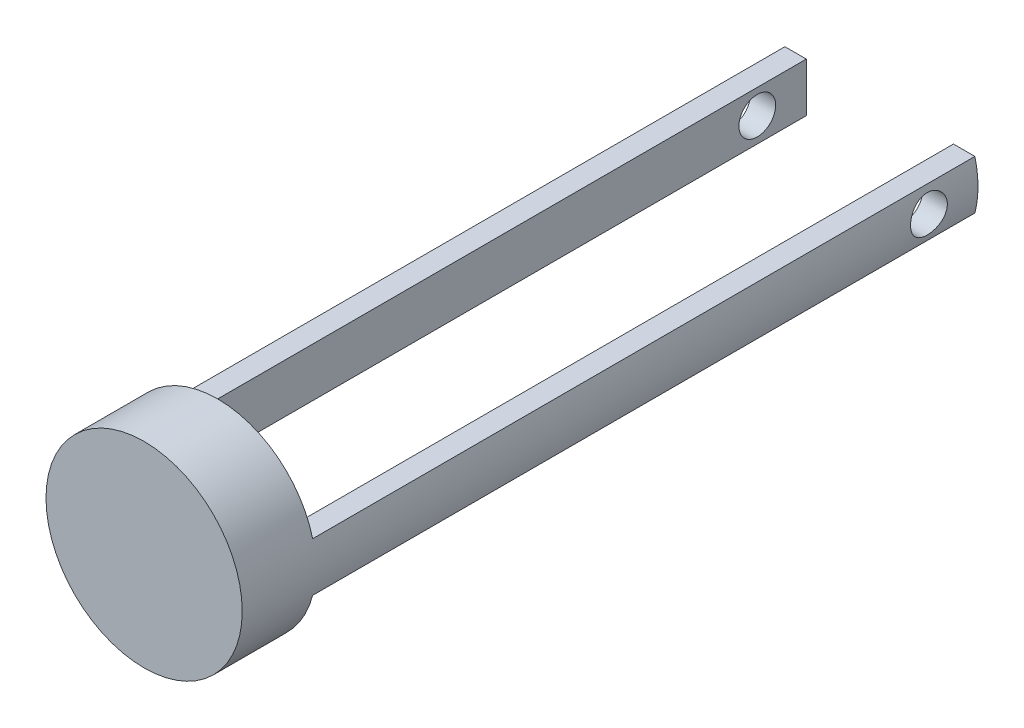
ISO-10303-21;
HEADER;
FILE_DESCRIPTION(('STEP AP214'),'2;1');
FILE_NAME('part.step','',(''),(''),'','','');
FILE_SCHEMA(('AUTOMOTIVE_DESIGN { 1 0 10303 214 1 1 1 1 }'));
ENDSEC;
DATA;
#1=APPLICATION_CONTEXT('core data for automotive mechanical design processes');
#2=APPLICATION_PROTOCOL_DEFINITION('international standard','automotive_design',2000,#1);
#3=PRODUCT_CONTEXT('',#1,'mechanical');
#4=PRODUCT('Part','Part','',(#3));
#5=PRODUCT_RELATED_PRODUCT_CATEGORY('part','',(#4));
#6=PRODUCT_DEFINITION_FORMATION('','',#4);
#7=PRODUCT_DEFINITION_CONTEXT('part definition',#1,'design');
#8=PRODUCT_DEFINITION('design','',#6,#7);
#9=PRODUCT_DEFINITION_SHAPE('','',#8);
#10=(LENGTH_UNIT() NAMED_UNIT(*) SI_UNIT(.MILLI.,.METRE.));
#11=(NAMED_UNIT(*) PLANE_ANGLE_UNIT() SI_UNIT($,.RADIAN.));
#12=(NAMED_UNIT(*) SI_UNIT($,.STERADIAN.) SOLID_ANGLE_UNIT());
#13=UNCERTAINTY_MEASURE_WITH_UNIT(LENGTH_MEASURE(1.E-05),#10,'distance_accuracy_value','');
#14=(GEOMETRIC_REPRESENTATION_CONTEXT(3) GLOBAL_UNCERTAINTY_ASSIGNED_CONTEXT((#13)) GLOBAL_UNIT_ASSIGNED_CONTEXT((#10,
#11,#12)) REPRESENTATION_CONTEXT('',''));
#15=CARTESIAN_POINT('',(0.,0.,0.));
#16=DIRECTION('',(0.,0.,1.));
#17=DIRECTION('',(1.,0.,0.));
#18=AXIS2_PLACEMENT_3D('',#15,#16,#17);
#19=CARTESIAN_POINT('',(0.,0.,-38.1));
#20=DIRECTION('',(0.,0.,1.));
#21=DIRECTION('',(1.,0.,0.));
#22=AXIS2_PLACEMENT_3D('',#19,#20,#21);
#23=CYLINDRICAL_SURFACE('',#22,50.8);
#24=CARTESIAN_POINT('',(-50.8,0.,-365.125));
#25=CARTESIAN_POINT('',(-50.8000023043984,-0.265112508847247,-365.125004788771));
#26=CARTESIAN_POINT('',(-50.797920970951,-0.530163183869243,-365.113928461929));
#27=CARTESIAN_POINT('',(-50.7896587686576,-1.05843450705729,-365.069718641948));
#28=CARTESIAN_POINT('',(-50.7834771603281,-1.32165481646296,-365.036581170084));
#29=CARTESIAN_POINT('',(-50.7671781209653,-1.84448038090155,-364.948468416572));
#30=CARTESIAN_POINT('',(-50.7570577920175,-2.10408282808438,-364.89347705529));
#31=CARTESIAN_POINT('',(-50.7331648032312,-2.61764541143761,-364.762085315767));
#32=CARTESIAN_POINT('',(-50.7193920765346,-2.87160544422974,-364.685684545618));
#33=CARTESIAN_POINT('',(-50.688591382839,-3.37186240146239,-364.512137803644));
#34=CARTESIAN_POINT('',(-50.6715664616592,-3.6181662472625,-364.415011232531));
#35=CARTESIAN_POINT('',(-50.6347225267335,-4.10166609552224,-364.200691124805));
#36=CARTESIAN_POINT('',(-50.6149034853259,-4.33886200778398,-364.083497389524));
#37=CARTESIAN_POINT('',(-50.5730208007042,-4.80247152155046,-363.829925997398));
#38=CARTESIAN_POINT('',(-50.5509577817929,-5.02888809640677,-363.693553672258));
#39=CARTESIAN_POINT('',(-50.5051766338902,-5.46957355155657,-363.402508828752));
#40=CARTESIAN_POINT('',(-50.4814579186527,-5.68383807990406,-363.247829814764));
#41=CARTESIAN_POINT('',(-50.4327680579375,-6.10085539778908,-362.919585027289));
#42=CARTESIAN_POINT('',(-50.407786507427,-6.30346644002781,-362.745840691591));
#43=CARTESIAN_POINT('',(-50.3574838953207,-6.69346707062098,-362.381909282304));
#44=CARTESIAN_POINT('',(-50.3321626843611,-6.88084968844638,-362.191714760257));
#45=CARTESIAN_POINT('',(-50.2818970109564,-7.2390296240496,-361.796229101085));
#46=CARTESIAN_POINT('',(-50.2569525763597,-7.4098257209028,-361.590936854577));
#47=CARTESIAN_POINT('',(-50.2081543813486,-7.73356504785847,-361.166753919925));
#48=CARTESIAN_POINT('',(-50.1843001322999,-7.88651632492305,-360.947869429846));
#49=CARTESIAN_POINT('',(-50.1381535039642,-8.17478181829502,-360.496016888366));
#50=CARTESIAN_POINT('',(-50.1158758542569,-8.30993784567323,-360.26294636858));
#51=CARTESIAN_POINT('',(-50.0737609859751,-8.56005533230363,-359.786111783907));
#52=CARTESIAN_POINT('',(-50.0539228358011,-8.67502450776012,-359.542351849652));
#53=CARTESIAN_POINT('',(-50.0172588040603,-8.88397902900869,-359.045739568071));
#54=CARTESIAN_POINT('',(-50.000433308317,-8.9779616874875,-358.792886061124));
#55=CARTESIAN_POINT('',(-49.9702997106796,-9.14419435550265,-358.279929307469));
#56=CARTESIAN_POINT('',(-49.9569915629724,-9.21644464810364,-358.019826155235));
#57=CARTESIAN_POINT('',(-49.9344250561705,-9.33793182357615,-357.497305238289));
#58=CARTESIAN_POINT('',(-49.9251216274816,-9.38742527149659,-357.234949061266));
#59=CARTESIAN_POINT('',(-49.910619554215,-9.46422671721476,-356.706896539154));
#60=CARTESIAN_POINT('',(-49.9054208811112,-9.49153486919061,-356.441200217289));
#61=CARTESIAN_POINT('',(-49.8992841058544,-9.52374484120453,-355.908424737124));
#62=CARTESIAN_POINT('',(-49.8983456679072,-9.52864842718343,-355.641345689472));
#63=CARTESIAN_POINT('',(-49.9007566535589,-9.51601423280106,-355.107739498825));
#64=CARTESIAN_POINT('',(-49.9041060459689,-9.49847661567283,-354.84121235183));
#65=CARTESIAN_POINT('',(-49.9149201445867,-9.44148142726203,-354.314160137933));
#66=CARTESIAN_POINT('',(-49.9223299738237,-9.4023161019449,-354.053602276199));
#67=CARTESIAN_POINT('',(-49.9410115252385,-9.30257696494227,-353.53676126616));
#68=CARTESIAN_POINT('',(-49.952283208258,-9.24200337033153,-353.280478074538));
#69=CARTESIAN_POINT('',(-49.9783616513505,-9.09992177249048,-352.774011060997));
#70=CARTESIAN_POINT('',(-49.9931678728719,-9.01841695837157,-352.523826316261));
#71=CARTESIAN_POINT('',(-50.025900060386,-8.83504348397212,-352.031141686507));
#72=CARTESIAN_POINT('',(-50.043827186283,-8.73316725042239,-351.788644698444));
#73=CARTESIAN_POINT('',(-50.0824031709965,-8.50916422712331,-351.311694349798));
#74=CARTESIAN_POINT('',(-50.1030671805106,-8.38692365616126,-351.077295660474));
#75=CARTESIAN_POINT('',(-50.1464540322915,-8.12348205098999,-350.619599405587));
#76=CARTESIAN_POINT('',(-50.1691769459655,-7.98228035908677,-350.396302225463));
#77=CARTESIAN_POINT('',(-50.2160493936172,-7.68189318788733,-349.962287945055));
#78=CARTESIAN_POINT('',(-50.2401990266024,-7.52270645981546,-349.751571719872));
#79=CARTESIAN_POINT('',(-50.2892571274404,-7.18744124079355,-349.34412926588));
#80=CARTESIAN_POINT('',(-50.3141656031193,-7.01136257559606,-349.147403181421));
#81=CARTESIAN_POINT('',(-50.3644533747145,-6.64058559937809,-348.766256904367));
#82=CARTESIAN_POINT('',(-50.3898338939651,-6.44563715859383,-348.582080107528));
#83=CARTESIAN_POINT('',(-50.4399594753772,-6.04086631926162,-348.230782202942));
#84=CARTESIAN_POINT('',(-50.4647045496383,-5.83104420421459,-348.063660770257));
#85=CARTESIAN_POINT('',(-50.5128705142384,-5.39790651730755,-347.747604203863));
#86=CARTESIAN_POINT('',(-50.5362911136604,-5.17458800311414,-347.59867305733));
#87=CARTESIAN_POINT('',(-50.5811352341607,-4.7161191915141,-347.320159564345));
#88=CARTESIAN_POINT('',(-50.6025595107767,-4.48097342261373,-347.190569886563));
#89=CARTESIAN_POINT('',(-50.642846342037,-4.00005209290043,-346.951449390228));
#90=CARTESIAN_POINT('',(-50.6617051279077,-3.75426157828498,-346.841948001382));
#91=CARTESIAN_POINT('',(-50.696288210239,-3.25410388481665,-346.644065616789));
#92=CARTESIAN_POINT('',(-50.7120124983682,-2.99973668316924,-346.555684677179));
#93=CARTESIAN_POINT('',(-50.739875793157,-2.48427299353883,-346.400737333101));
#94=CARTESIAN_POINT('',(-50.7520151103627,-2.22317709055708,-346.334169039071));
#95=CARTESIAN_POINT('',(-50.7723611085094,-1.69613833043519,-346.223366890135));
#96=CARTESIAN_POINT('',(-50.7805678424126,-1.43019553862064,-346.179132734442));
#97=CARTESIAN_POINT('',(-50.7927215017215,-0.899376816663163,-346.113841893251));
#98=CARTESIAN_POINT('',(-50.7967295717891,-0.634543174935025,-346.092452430441));
#99=CARTESIAN_POINT('',(-50.8005862157543,-0.103985610052731,-346.071868563183));
#100=CARTESIAN_POINT('',(-50.8004348305161,0.161738304329396,-346.072673940685));
#101=CARTESIAN_POINT('',(-50.7959769547956,0.692142454708582,-346.096472488089));
#102=CARTESIAN_POINT('',(-50.7916706561851,0.956822738333291,-346.119464633417));
#103=CARTESIAN_POINT('',(-50.7790243149838,1.48324346441209,-346.187452586734));
#104=CARTESIAN_POINT('',(-50.7706842789728,1.74498391166095,-346.232448358831));
#105=CARTESIAN_POINT('',(-50.7502864886563,2.26157303900356,-346.343642119171));
#106=CARTESIAN_POINT('',(-50.738259050563,2.51646013039424,-346.409667378258));
#107=CARTESIAN_POINT('',(-50.7107902430649,3.01981997740711,-346.56254881302));
#108=CARTESIAN_POINT('',(-50.6953476282127,3.26829035596946,-346.649412589071));
#109=CARTESIAN_POINT('',(-50.6614752624652,3.75698213375344,-346.843299463681));
#110=CARTESIAN_POINT('',(-50.6430459421786,3.99720471606091,-346.950319656544));
#111=CARTESIAN_POINT('',(-50.6036984790553,4.46782594571761,-347.183756521544));
#112=CARTESIAN_POINT('',(-50.5827802620486,4.69822430002295,-347.310173771752));
#113=CARTESIAN_POINT('',(-50.5387816917786,5.1501113065671,-347.582993489899));
#114=CARTESIAN_POINT('',(-50.515680254336,5.37147545156088,-347.729598799169));
#115=CARTESIAN_POINT('',(-50.4681465233909,5.80111284871438,-348.040697034103));
#116=CARTESIAN_POINT('',(-50.4437141825509,6.0093856346726,-348.205190596225));
#117=CARTESIAN_POINT('',(-50.3941943441381,6.41141160413165,-348.550907716413));
#118=CARTESIAN_POINT('',(-50.3691069427881,6.60516690412749,-348.73212882715));
#119=CARTESIAN_POINT('',(-50.3189530919444,6.97697454920346,-349.110179248128));
#120=CARTESIAN_POINT('',(-50.2938866562871,7.15502003601338,-349.307015304709));
#121=CARTESIAN_POINT('',(-50.2441499112786,7.49636926988221,-349.717628280849));
#122=CARTESIAN_POINT('',(-50.2194893197271,7.65944517668603,-349.931595864147));
#123=CARTESIAN_POINT('',(-50.1716296386834,7.96691826070196,-350.372567052964));
#124=CARTESIAN_POINT('',(-50.1484299013601,8.11132374785979,-350.599564793526));
#125=CARTESIAN_POINT('',(-50.104141240561,8.38055242541837,-351.06520997076));
#126=CARTESIAN_POINT('',(-50.0830531538089,8.50536786445647,-351.303861970047));
#127=CARTESIAN_POINT('',(-50.0436227916385,8.7343758725732,-351.7909707958));
#128=CARTESIAN_POINT('',(-50.0252794500894,8.83857645409464,-352.039423767678));
#129=CARTESIAN_POINT('',(-49.991949819316,9.02518153236794,-352.543276768453));
#130=CARTESIAN_POINT('',(-49.9769482198188,9.10768575929388,-352.798638840405));
#131=CARTESIAN_POINT('',(-49.9506382617657,9.25089425026563,-353.315592777864));
#132=CARTESIAN_POINT('',(-49.9393298965773,9.31159855346104,-353.577184632183));
#133=CARTESIAN_POINT('',(-49.9207462929837,9.41071923612406,-354.104674298093));
#134=CARTESIAN_POINT('',(-49.9134706721004,9.44913772926409,-354.370571698869));
#135=CARTESIAN_POINT('',(-49.9031708172262,9.50338405002132,-354.904741779703));
#136=CARTESIAN_POINT('',(-49.9001465311871,9.51921215420785,-355.173014430641));
#137=CARTESIAN_POINT('',(-49.8984542616847,9.52807846391424,-355.705678460987));
#138=CARTESIAN_POINT('',(-49.8997177737947,9.52147504712337,-355.970063726472));
#139=CARTESIAN_POINT('',(-49.9064130476676,9.48631941860531,-356.497315281026));
#140=CARTESIAN_POINT('',(-49.9118447625194,9.45776745389854,-356.760181587157));
#141=CARTESIAN_POINT('',(-49.926717096315,9.37894048458691,-357.2825167859));
#142=CARTESIAN_POINT('',(-49.9361576704896,9.32866572257263,-357.541985716418));
#143=CARTESIAN_POINT('',(-49.9587726900808,9.20678377990473,-358.055696825685));
#144=CARTESIAN_POINT('',(-49.9719471496636,9.13517651831731,-358.309938984601));
#145=CARTESIAN_POINT('',(-50.0016187853871,8.97134480108404,-358.810904367681));
#146=CARTESIAN_POINT('',(-50.0181090291021,8.87916331717316,-359.057642062716));
#147=CARTESIAN_POINT('',(-50.0539668008581,8.67474334449546,-359.542551240393));
#148=CARTESIAN_POINT('',(-50.0733353765474,8.56249754973949,-359.780719564606));
#149=CARTESIAN_POINT('',(-50.1143979526182,8.31879655674636,-360.246760783255));
#150=CARTESIAN_POINT('',(-50.1360916183645,8.18734412181115,-360.474635152542));
#151=CARTESIAN_POINT('',(-50.1812049197008,7.90613329306917,-360.918621672288));
#152=CARTESIAN_POINT('',(-50.2046246178186,7.75637423595311,-361.134733396138));
#153=CARTESIAN_POINT('',(-50.2529049722162,7.43720184527719,-361.556905358862));
#154=CARTESIAN_POINT('',(-50.2777819490969,7.26752789278039,-361.762766744573));
#155=CARTESIAN_POINT('',(-50.3279528969357,6.91154528184574,-362.159512292951));
#156=CARTESIAN_POINT('',(-50.35324687181,6.72523646711119,-362.350396314864));
#157=CARTESIAN_POINT('',(-50.4035526251453,6.33720415994266,-362.715935026492));
#158=CARTESIAN_POINT('',(-50.4285643347534,6.1354769959658,-362.890585828542));
#159=CARTESIAN_POINT('',(-50.4776034723741,5.71801609618883,-363.222401850466));
#160=CARTESIAN_POINT('',(-50.5016309227513,5.50228267892913,-363.37956746778));
#161=CARTESIAN_POINT('',(-50.5482487447998,5.05621262901415,-363.676683123775));
#162=CARTESIAN_POINT('',(-50.5708238094438,4.82575961122896,-363.816460917954));
#163=CARTESIAN_POINT('',(-50.613643474036,4.35376001505354,-364.076020007218));
#164=CARTESIAN_POINT('',(-50.6338889285696,4.11221755045537,-364.195808642356));
#165=CARTESIAN_POINT('',(-50.6714702872972,3.61980641448797,-364.414484447015));
#166=CARTESIAN_POINT('',(-50.6888080553392,3.36894384433922,-364.513385016564));
#167=CARTESIAN_POINT('',(-50.7200912824853,2.85963023555816,-364.689597095273));
#168=CARTESIAN_POINT('',(-50.7340374247102,2.60118073681126,-364.766912952359));
#169=CARTESIAN_POINT('',(-50.7636794180959,1.95817812885178,-364.929844559949));
#170=CARTESIAN_POINT('',(-50.777231781538,1.57027857459066,-365.002933251594));
#171=CARTESIAN_POINT('',(-50.7953902462665,0.788207041975276,-365.100506795051));
#172=CARTESIAN_POINT('',(-50.7999965749857,0.394035223336032,-365.124992882476));
#173=CARTESIAN_POINT('',(-50.8,0.,-365.125));
#174=B_SPLINE_CURVE_WITH_KNOTS('',3,(#24,#25,#26,#27,#28,#29,#30,#31,#32,#33,#34,#35,#36,#37,
#38,#39,#40,#41,#42,#43,#44,#45,#46,#47,#48,#49,#50,#51,#52,#53,#54,#55,#56,#57,#58,#59,#60,#61,
#62,#63,#64,#65,#66,#67,#68,#69,#70,#71,#72,#73,#74,#75,#76,#77,#78,#79,#80,#81,#82,#83,#84,#85,
#86,#87,#88,#89,#90,#91,#92,#93,#94,#95,#96,#97,#98,#99,#100,#101,#102,#103,#104,#105,#106,#107,
#108,#109,#110,#111,#112,#113,#114,#115,#116,#117,#118,#119,#120,#121,#122,#123,#124,#125,#126,
#127,#128,#129,#130,#131,#132,#133,#134,#135,#136,#137,#138,#139,#140,#141,#142,#143,#144,#145,
#146,#147,#148,#149,#150,#151,#152,#153,#154,#155,#156,#157,#158,#159,#160,#161,#162,#163,#164,
#165,#166,#167,#168,#169,#170,#171,#172,#173),.UNSPECIFIED.,.T.,.F.,(4,2,2,2,2,2,2,2,2,2,2,2,2,
2,2,2,2,2,2,2,2,2,2,2,2,2,2,2,2,2,2,2,2,2,2,2,2,2,2,2,2,2,2,2,2,2,2,2,2,2,2,2,2,2,2,2,2,2,2,2,2,
2,2,2,2,2,2,2,2,2,2,2,2,2,4),(0.,0.79499177181422,1.5901269591912,2.38584827678686,
3.18158416129831,3.97657842678296,4.77158056324146,5.56636212199542,6.36142653720992,
7.16470232685956,7.96834375413343,8.77204429223996,9.57538099639204,10.3854357195156,
11.1951801307728,12.0050281700247,12.8148656605273,13.6153344060372,14.4157975885915,
15.2161976770869,16.0165919436571,16.8064264836542,17.5962530151465,18.3859592788276,
19.1759596709774,19.9705319202777,20.7651317375924,21.5597867612142,22.3544499829188,
23.1616625319108,23.9688596990949,24.7762334816187,25.5833004498995,26.3915405049139,
27.1997827081837,28.0079548774171,28.8161161622785,29.6123373617529,30.4085507388439,
31.2047273489401,32.0009026603102,32.7907001544658,33.5807861484612,34.3707583328656,
35.1607540646483,35.9593617628146,36.7579978844181,37.5565173459033,38.3553837015661,
39.1648864889183,39.9740277282663,40.7834883247113,41.5926336847315,42.3979919825267,
43.2033488340037,44.0086292898275,44.8138998866897,45.6063659655106,46.3988231256346,
47.1912714361773,47.9837227532444,48.7745341768051,49.565634146179,50.3566204101137,
51.1476353425888,51.9504894513916,52.7533511043897,53.5564045405864,54.3594397195504,
55.169885129453,55.9800322844439,56.7896581277674,57.5991207658433,58.7807425830139,
59.9623343597249),.UNSPECIFIED.);
#175=CARTESIAN_POINT('',(-50.8,0.,-365.125));
#176=VERTEX_POINT('',#175);
#177=EDGE_CURVE('E126',#176,#176,#174,.T.);
#178=ORIENTED_EDGE('',*,*,#177,.F.);
#179=EDGE_LOOP('',(#178));
#180=FACE_BOUND('',#179,.T.);
#181=CARTESIAN_POINT('',(50.8,0.,-365.125));
#182=CARTESIAN_POINT('',(50.8000023043984,0.265112508847247,-365.125004788771));
#183=CARTESIAN_POINT('',(50.797920970951,0.530163183869242,-365.113928461929));
#184=CARTESIAN_POINT('',(50.7896587686576,1.05843450705729,-365.069718641948));
#185=CARTESIAN_POINT('',(50.7834771603281,1.32165481646296,-365.036581170084));
#186=CARTESIAN_POINT('',(50.7671781209653,1.84448038090154,-364.948468416572));
#187=CARTESIAN_POINT('',(50.7570577920175,2.10408282808437,-364.89347705529));
#188=CARTESIAN_POINT('',(50.7331648032312,2.6176454114376,-364.762085315767));
#189=CARTESIAN_POINT('',(50.7193920765346,2.87160544422974,-364.685684545618));
#190=CARTESIAN_POINT('',(50.688591382839,3.37186240146239,-364.512137803644));
#191=CARTESIAN_POINT('',(50.6715664616592,3.6181662472625,-364.415011232531));
#192=CARTESIAN_POINT('',(50.6347225267335,4.10166609552224,-364.200691124805));
#193=CARTESIAN_POINT('',(50.6149034853259,4.33886200778398,-364.083497389524));
#194=CARTESIAN_POINT('',(50.5730208007042,4.80247152155046,-363.829925997398));
#195=CARTESIAN_POINT('',(50.5509577817929,5.02888809640677,-363.693553672258));
#196=CARTESIAN_POINT('',(50.5051766338902,5.46957355155657,-363.402508828752));
#197=CARTESIAN_POINT('',(50.4814579186527,5.68383807990406,-363.247829814764));
#198=CARTESIAN_POINT('',(50.4327680579375,6.10085539778906,-362.919585027289));
#199=CARTESIAN_POINT('',(50.407786507427,6.30346644002778,-362.745840691591));
#200=CARTESIAN_POINT('',(50.3574838953207,6.69346707062095,-362.381909282304));
#201=CARTESIAN_POINT('',(50.3321626843611,6.88084968844636,-362.191714760257));
#202=CARTESIAN_POINT('',(50.2818970109564,7.2390296240496,-361.796229101085));
#203=CARTESIAN_POINT('',(50.2569525763597,7.4098257209028,-361.590936854577));
#204=CARTESIAN_POINT('',(50.2081543813486,7.73356504785847,-361.166753919925));
#205=CARTESIAN_POINT('',(50.1843001322999,7.88651632492305,-360.947869429846));
#206=CARTESIAN_POINT('',(50.1381535039642,8.17478181829502,-360.496016888366));
#207=CARTESIAN_POINT('',(50.1158758542569,8.30993784567323,-360.26294636858));
#208=CARTESIAN_POINT('',(50.0737609859751,8.56005533230363,-359.786111783907));
#209=CARTESIAN_POINT('',(50.0539228358011,8.67502450776012,-359.542351849652));
#210=CARTESIAN_POINT('',(50.0172588040603,8.88397902900869,-359.045739568071));
#211=CARTESIAN_POINT('',(50.000433308317,8.9779616874875,-358.792886061124));
#212=CARTESIAN_POINT('',(49.9702997106796,9.14419435550265,-358.279929307469));
#213=CARTESIAN_POINT('',(49.9569915629724,9.21644464810364,-358.019826155235));
#214=CARTESIAN_POINT('',(49.9344250561705,9.33793182357615,-357.497305238289));
#215=CARTESIAN_POINT('',(49.9251216274816,9.38742527149659,-357.234949061266));
#216=CARTESIAN_POINT('',(49.910619554215,9.46422671721476,-356.706896539154));
#217=CARTESIAN_POINT('',(49.9054208811112,9.49153486919061,-356.441200217289));
#218=CARTESIAN_POINT('',(49.8992841058544,9.52374484120453,-355.908424737124));
#219=CARTESIAN_POINT('',(49.8983456679072,9.52864842718343,-355.641345689472));
#220=CARTESIAN_POINT('',(49.9007566535589,9.51601423280106,-355.107739498825));
#221=CARTESIAN_POINT('',(49.9041060459689,9.49847661567283,-354.84121235183));
#222=CARTESIAN_POINT('',(49.9149201445867,9.44148142726203,-354.314160137933));
#223=CARTESIAN_POINT('',(49.9223299738237,9.4023161019449,-354.053602276199));
#224=CARTESIAN_POINT('',(49.9410115252385,9.30257696494227,-353.53676126616));
#225=CARTESIAN_POINT('',(49.952283208258,9.24200337033153,-353.280478074538));
#226=CARTESIAN_POINT('',(49.9783616513505,9.09992177249048,-352.774011060997));
#227=CARTESIAN_POINT('',(49.9931678728719,9.01841695837157,-352.523826316261));
#228=CARTESIAN_POINT('',(50.025900060386,8.83504348397212,-352.031141686507));
#229=CARTESIAN_POINT('',(50.043827186283,8.73316725042239,-351.788644698444));
#230=CARTESIAN_POINT('',(50.0824031709965,8.50916422712331,-351.311694349798));
#231=CARTESIAN_POINT('',(50.1030671805106,8.38692365616126,-351.077295660474));
#232=CARTESIAN_POINT('',(50.1464540322915,8.12348205098999,-350.619599405587));
#233=CARTESIAN_POINT('',(50.1691769459655,7.98228035908677,-350.396302225463));
#234=CARTESIAN_POINT('',(50.2160493936172,7.68189318788733,-349.962287945055));
#235=CARTESIAN_POINT('',(50.2401990266024,7.52270645981546,-349.751571719872));
#236=CARTESIAN_POINT('',(50.2892571274404,7.18744124079355,-349.34412926588));
#237=CARTESIAN_POINT('',(50.3141656031193,7.01136257559606,-349.147403181421));
#238=CARTESIAN_POINT('',(50.3644533747145,6.64058559937809,-348.766256904367));
#239=CARTESIAN_POINT('',(50.3898338939651,6.44563715859383,-348.582080107528));
#240=CARTESIAN_POINT('',(50.4399594753772,6.04086631926162,-348.230782202942));
#241=CARTESIAN_POINT('',(50.4647045496383,5.83104420421459,-348.063660770257));
#242=CARTESIAN_POINT('',(50.5128705142384,5.39790651730755,-347.747604203863));
#243=CARTESIAN_POINT('',(50.5362911136604,5.17458800311414,-347.59867305733));
#244=CARTESIAN_POINT('',(50.5811352341607,4.7161191915141,-347.320159564345));
#245=CARTESIAN_POINT('',(50.6025595107767,4.48097342261373,-347.190569886563));
#246=CARTESIAN_POINT('',(50.642846342037,4.00005209290043,-346.951449390228));
#247=CARTESIAN_POINT('',(50.6617051279077,3.75426157828498,-346.841948001382));
#248=CARTESIAN_POINT('',(50.696288210239,3.25410388481665,-346.644065616789));
#249=CARTESIAN_POINT('',(50.7120124983682,2.99973668316924,-346.555684677179));
#250=CARTESIAN_POINT('',(50.739875793157,2.48427299353883,-346.400737333101));
#251=CARTESIAN_POINT('',(50.7520151103627,2.22317709055708,-346.334169039071));
#252=CARTESIAN_POINT('',(50.7723611085094,1.69613833043519,-346.223366890135));
#253=CARTESIAN_POINT('',(50.7805678424126,1.43019553862064,-346.179132734442));
#254=CARTESIAN_POINT('',(50.7927215017215,0.899376816663163,-346.113841893251));
#255=CARTESIAN_POINT('',(50.7967295717891,0.634543174935025,-346.092452430441));
#256=CARTESIAN_POINT('',(50.8005862157543,0.103985610052731,-346.071868563183));
#257=CARTESIAN_POINT('',(50.8004348305161,-0.161738304329396,-346.072673940685));
#258=CARTESIAN_POINT('',(50.7959769547956,-0.692142454708582,-346.096472488089));
#259=CARTESIAN_POINT('',(50.7916706561851,-0.956822738333291,-346.119464633417));
#260=CARTESIAN_POINT('',(50.7790243149838,-1.48324346441209,-346.187452586734));
#261=CARTESIAN_POINT('',(50.7706842789728,-1.74498391166095,-346.232448358831));
#262=CARTESIAN_POINT('',(50.7502864886563,-2.26157303900356,-346.343642119171));
#263=CARTESIAN_POINT('',(50.738259050563,-2.51646013039424,-346.409667378258));
#264=CARTESIAN_POINT('',(50.7107902430649,-3.01981997740711,-346.56254881302));
#265=CARTESIAN_POINT('',(50.6953476282127,-3.26829035596946,-346.649412589071));
#266=CARTESIAN_POINT('',(50.6614752624652,-3.75698213375344,-346.843299463681));
#267=CARTESIAN_POINT('',(50.6430459421786,-3.99720471606091,-346.950319656544));
#268=CARTESIAN_POINT('',(50.6036984790553,-4.46782594571761,-347.183756521544));
#269=CARTESIAN_POINT('',(50.5827802620486,-4.69822430002295,-347.310173771752));
#270=CARTESIAN_POINT('',(50.5387816917786,-5.1501113065671,-347.582993489899));
#271=CARTESIAN_POINT('',(50.515680254336,-5.37147545156088,-347.729598799169));
#272=CARTESIAN_POINT('',(50.4681465233909,-5.80111284871438,-348.040697034103));
#273=CARTESIAN_POINT('',(50.4437141825509,-6.0093856346726,-348.205190596225));
#274=CARTESIAN_POINT('',(50.3941943441381,-6.41141160413165,-348.550907716413));
#275=CARTESIAN_POINT('',(50.3691069427881,-6.60516690412749,-348.73212882715));
#276=CARTESIAN_POINT('',(50.3189530919444,-6.97697454920346,-349.110179248128));
#277=CARTESIAN_POINT('',(50.2938866562871,-7.15502003601338,-349.307015304709));
#278=CARTESIAN_POINT('',(50.2441499112786,-7.49636926988221,-349.717628280849));
#279=CARTESIAN_POINT('',(50.2194893197271,-7.65944517668603,-349.931595864147));
#280=CARTESIAN_POINT('',(50.1716296386834,-7.96691826070196,-350.372567052964));
#281=CARTESIAN_POINT('',(50.1484299013601,-8.11132374785979,-350.599564793526));
#282=CARTESIAN_POINT('',(50.104141240561,-8.38055242541837,-351.06520997076));
#283=CARTESIAN_POINT('',(50.0830531538089,-8.50536786445647,-351.303861970047));
#284=CARTESIAN_POINT('',(50.0436227916385,-8.7343758725732,-351.7909707958));
#285=CARTESIAN_POINT('',(50.0252794500894,-8.83857645409464,-352.039423767678));
#286=CARTESIAN_POINT('',(49.991949819316,-9.02518153236794,-352.543276768453));
#287=CARTESIAN_POINT('',(49.9769482198188,-9.10768575929388,-352.798638840405));
#288=CARTESIAN_POINT('',(49.9506382617657,-9.25089425026563,-353.315592777864));
#289=CARTESIAN_POINT('',(49.9393298965773,-9.31159855346104,-353.577184632183));
#290=CARTESIAN_POINT('',(49.9207462929837,-9.41071923612406,-354.104674298093));
#291=CARTESIAN_POINT('',(49.9134706721004,-9.44913772926409,-354.370571698869));
#292=CARTESIAN_POINT('',(49.9031708172262,-9.50338405002132,-354.904741779703));
#293=CARTESIAN_POINT('',(49.9001465311871,-9.51921215420785,-355.173014430641));
#294=CARTESIAN_POINT('',(49.8984542616847,-9.52807846391424,-355.705678460987));
#295=CARTESIAN_POINT('',(49.8997177737947,-9.52147504712337,-355.970063726472));
#296=CARTESIAN_POINT('',(49.9064130476676,-9.48631941860531,-356.497315281026));
#297=CARTESIAN_POINT('',(49.9118447625194,-9.45776745389854,-356.760181587157));
#298=CARTESIAN_POINT('',(49.926717096315,-9.37894048458691,-357.2825167859));
#299=CARTESIAN_POINT('',(49.9361576704896,-9.32866572257263,-357.541985716418));
#300=CARTESIAN_POINT('',(49.9587726900808,-9.20678377990473,-358.055696825685));
#301=CARTESIAN_POINT('',(49.9719471496636,-9.13517651831731,-358.309938984601));
#302=CARTESIAN_POINT('',(50.0016187853871,-8.97134480108404,-358.810904367681));
#303=CARTESIAN_POINT('',(50.0181090291021,-8.87916331717316,-359.057642062716));
#304=CARTESIAN_POINT('',(50.0539668008581,-8.67474334449546,-359.542551240393));
#305=CARTESIAN_POINT('',(50.0733353765474,-8.56249754973949,-359.780719564606));
#306=CARTESIAN_POINT('',(50.1143979526182,-8.31879655674636,-360.246760783255));
#307=CARTESIAN_POINT('',(50.1360916183645,-8.18734412181115,-360.474635152542));
#308=CARTESIAN_POINT('',(50.1812049197008,-7.90613329306917,-360.918621672288));
#309=CARTESIAN_POINT('',(50.2046246178186,-7.75637423595311,-361.134733396138));
#310=CARTESIAN_POINT('',(50.2529049722162,-7.43720184527719,-361.556905358862));
#311=CARTESIAN_POINT('',(50.2777819490969,-7.26752789278039,-361.762766744573));
#312=CARTESIAN_POINT('',(50.3279528969357,-6.91154528184574,-362.159512292951));
#313=CARTESIAN_POINT('',(50.35324687181,-6.72523646711119,-362.350396314864));
#314=CARTESIAN_POINT('',(50.4035526251453,-6.33720415994266,-362.715935026492));
#315=CARTESIAN_POINT('',(50.4285643347534,-6.1354769959658,-362.890585828542));
#316=CARTESIAN_POINT('',(50.4776034723741,-5.71801609618883,-363.222401850466));
#317=CARTESIAN_POINT('',(50.5016309227513,-5.50228267892913,-363.37956746778));
#318=CARTESIAN_POINT('',(50.5482487447998,-5.05621262901415,-363.676683123775));
#319=CARTESIAN_POINT('',(50.5708238094438,-4.82575961122896,-363.816460917954));
#320=CARTESIAN_POINT('',(50.613643474036,-4.35376001505354,-364.076020007218));
#321=CARTESIAN_POINT('',(50.6338889285696,-4.11221755045537,-364.195808642356));
#322=CARTESIAN_POINT('',(50.6714702872972,-3.61980641448797,-364.414484447015));
#323=CARTESIAN_POINT('',(50.6888080553392,-3.36894384433922,-364.513385016564));
#324=CARTESIAN_POINT('',(50.7200912824853,-2.85963023555816,-364.689597095273));
#325=CARTESIAN_POINT('',(50.7340374247102,-2.60118073681126,-364.766912952359));
#326=CARTESIAN_POINT('',(50.7636794180959,-1.95817812885178,-364.929844559949));
#327=CARTESIAN_POINT('',(50.777231781538,-1.57027857459066,-365.002933251594));
#328=CARTESIAN_POINT('',(50.7953902462665,-0.788207041975276,-365.100506795051));
#329=CARTESIAN_POINT('',(50.7999965749857,-0.394035223336032,-365.124992882476));
#330=CARTESIAN_POINT('',(50.8,0.,-365.125));
#331=B_SPLINE_CURVE_WITH_KNOTS('',3,(#181,#182,#183,#184,#185,#186,#187,#188,#189,#190,#191,
#192,#193,#194,#195,#196,#197,#198,#199,#200,#201,#202,#203,#204,#205,#206,#207,#208,#209,#210,
#211,#212,#213,#214,#215,#216,#217,#218,#219,#220,#221,#222,#223,#224,#225,#226,#227,#228,#229,
#230,#231,#232,#233,#234,#235,#236,#237,#238,#239,#240,#241,#242,#243,#244,#245,#246,#247,#248,
#249,#250,#251,#252,#253,#254,#255,#256,#257,#258,#259,#260,#261,#262,#263,#264,#265,#266,#267,
#268,#269,#270,#271,#272,#273,#274,#275,#276,#277,#278,#279,#280,#281,#282,#283,#284,#285,#286,
#287,#288,#289,#290,#291,#292,#293,#294,#295,#296,#297,#298,#299,#300,#301,#302,#303,#304,#305,
#306,#307,#308,#309,#310,#311,#312,#313,#314,#315,#316,#317,#318,#319,#320,#321,#322,#323,#324,
#325,#326,#327,#328,#329,#330),.UNSPECIFIED.,.T.,.F.,(4,2,2,2,2,2,2,2,2,2,2,2,2,2,2,2,2,2,2,2,2,
2,2,2,2,2,2,2,2,2,2,2,2,2,2,2,2,2,2,2,2,2,2,2,2,2,2,2,2,2,2,2,2,2,2,2,2,2,2,2,2,2,2,2,2,2,2,2,2,
2,2,2,2,2,4),(0.,0.794991771814219,1.5901269591912,2.38584827678685,3.18158416129831,
3.97657842678296,4.77158056324146,5.56636212199542,6.36142653720992,7.16470232685948,
7.96834375413343,8.77204429223996,9.57538099639204,10.3854357195156,11.1951801307728,
12.0050281700247,12.8148656605273,13.6153344060372,14.4157975885915,15.2161976770869,
16.0165919436571,16.8064264836542,17.5962530151465,18.3859592788276,19.1759596709774,
19.9705319202777,20.7651317375924,21.5597867612142,22.3544499829188,23.1616625319108,
23.9688596990949,24.7762334816187,25.5833004498995,26.3915405049139,27.1997827081837,
28.0079548774171,28.8161161622785,29.6123373617529,30.4085507388439,31.2047273489401,
32.0009026603102,32.7907001544658,33.5807861484612,34.3707583328656,35.1607540646483,
35.9593617628146,36.7579978844181,37.5565173459033,38.3553837015661,39.1648864889183,
39.9740277282663,40.7834883247113,41.5926336847315,42.3979919825267,43.2033488340037,
44.0086292898275,44.8138998866897,45.6063659655106,46.3988231256346,47.1912714361773,
47.9837227532444,48.7745341768051,49.565634146179,50.3566204101137,51.1476353425888,
51.9504894513916,52.7533511043897,53.5564045405864,54.3594397195504,55.169885129453,
55.9800322844439,56.7896581277674,57.5991207658433,58.7807425830139,59.9623343597249),.UNSPECIFIED.);
#332=CARTESIAN_POINT('',(50.8,0.,-365.125));
#333=VERTEX_POINT('',#332);
#334=EDGE_CURVE('E129',#333,#333,#331,.T.);
#335=ORIENTED_EDGE('',*,*,#334,.F.);
#336=EDGE_LOOP('',(#335));
#337=FACE_BOUND('',#336,.T.);
#338=CARTESIAN_POINT('',(0.,0.,0.));
#339=DIRECTION('',(0.,0.,1.));
#340=DIRECTION('',(1.,0.,0.));
#341=AXIS2_PLACEMENT_3D('',#338,#339,#340);
#342=CIRCLE('',#341,50.8);
#343=CARTESIAN_POINT('',(50.8,0.,0.));
#344=VERTEX_POINT('',#343);
#345=EDGE_CURVE('E157',#344,#344,#342,.T.);
#346=ORIENTED_EDGE('',*,*,#345,.F.);
#347=EDGE_LOOP('',(#346));
#348=FACE_BOUND('',#347,.T.);
#349=CARTESIAN_POINT('',(0.,0.,-38.1));
#350=DIRECTION('',(0.,0.,1.));
#351=DIRECTION('',(1.,0.,0.));
#352=AXIS2_PLACEMENT_3D('',#349,#350,#351);
#353=CIRCLE('',#352,50.8);
#354=CARTESIAN_POINT('',(-49.1868884968342,-12.7,-38.1));
#355=VERTEX_POINT('',#354);
#356=CARTESIAN_POINT('',(49.1868884968342,-12.7,-38.1));
#357=VERTEX_POINT('',#356);
#358=EDGE_CURVE('E107',#355,#357,#353,.T.);
#359=ORIENTED_EDGE('',*,*,#358,.T.);
#360=DIRECTION('',(0.,0.,1.));
#361=VECTOR('',#360,1.);
#362=CARTESIAN_POINT('',(49.1868884968342,-12.7,-381.));
#363=LINE('',#362,#361);
#364=CARTESIAN_POINT('',(49.1868884968342,-12.7,-381.));
#365=VERTEX_POINT('',#364);
#366=EDGE_CURVE('E101',#365,#357,#363,.T.);
#367=ORIENTED_EDGE('',*,*,#366,.F.);
#368=CARTESIAN_POINT('',(0.,0.,-381.));
#369=DIRECTION('',(0.,0.,1.));
#370=DIRECTION('',(1.,0.,0.));
#371=AXIS2_PLACEMENT_3D('',#368,#369,#370);
#372=CIRCLE('',#371,50.8);
#373=CARTESIAN_POINT('',(49.1868884968342,12.7,-381.));
#374=VERTEX_POINT('',#373);
#375=EDGE_CURVE('E104',#365,#374,#372,.T.);
#376=ORIENTED_EDGE('',*,*,#375,.T.);
#377=DIRECTION('',(0.,0.,1.));
#378=VECTOR('',#377,1.);
#379=CARTESIAN_POINT('',(49.1868884968342,12.7,-381.));
#380=LINE('',#379,#378);
#381=CARTESIAN_POINT('',(49.1868884968342,12.7,-38.1));
#382=VERTEX_POINT('',#381);
#383=EDGE_CURVE('E110',#374,#382,#380,.T.);
#384=ORIENTED_EDGE('',*,*,#383,.T.);
#385=CARTESIAN_POINT('',(-49.1868884968342,12.7,-38.1));
#386=VERTEX_POINT('',#385);
#387=EDGE_CURVE('E165',#382,#386,#353,.T.);
#388=ORIENTED_EDGE('',*,*,#387,.T.);
#389=DIRECTION('',(0.,0.,1.));
#390=VECTOR('',#389,1.);
#391=CARTESIAN_POINT('',(-49.1868884968342,12.7,-381.));
#392=LINE('',#391,#390);
#393=CARTESIAN_POINT('',(-49.1868884968342,12.7,-381.));
#394=VERTEX_POINT('',#393);
#395=EDGE_CURVE('E153',#394,#386,#392,.T.);
#396=ORIENTED_EDGE('',*,*,#395,.F.);
#397=CARTESIAN_POINT('',(0.,0.,-381.));
#398=DIRECTION('',(0.,0.,1.));
#399=DIRECTION('',(1.,0.,0.));
#400=AXIS2_PLACEMENT_3D('',#397,#398,#399);
#401=CIRCLE('',#400,50.8);
#402=CARTESIAN_POINT('',(-49.1868884968342,-12.7,-381.));
#403=VERTEX_POINT('',#402);
#404=EDGE_CURVE('E146',#394,#403,#401,.T.);
#405=ORIENTED_EDGE('',*,*,#404,.T.);
#406=DIRECTION('',(0.,0.,1.));
#407=VECTOR('',#406,1.);
#408=CARTESIAN_POINT('',(-49.1868884968342,-12.7,-381.));
#409=LINE('',#408,#407);
#410=EDGE_CURVE('E161',#403,#355,#409,.T.);
#411=ORIENTED_EDGE('',*,*,#410,.T.);
#412=EDGE_LOOP('',(#359,#367,#376,#384,#388,#396,#405,#411));
#413=FACE_BOUND('',#412,.T.);
#414=ADVANCED_FACE('F37',(#180,#337,#348,#413),#23,.T.);
#415=CARTESIAN_POINT('',(0.,0.,-38.1));
#416=DIRECTION('',(0.,0.,1.));
#417=DIRECTION('',(1.,0.,0.));
#418=AXIS2_PLACEMENT_3D('',#415,#416,#417);
#419=PLANE('',#418);
#420=DIRECTION('',(-1.,0.,0.));
#421=VECTOR('',#420,1.);
#422=CARTESIAN_POINT('',(0.,12.7,-38.1));
#423=LINE('',#422,#421);
#424=CARTESIAN_POINT('',(38.1,12.7,-38.1));
#425=VERTEX_POINT('',#424);
#426=EDGE_CURVE('E53',#382,#425,#423,.T.);
#427=ORIENTED_EDGE('',*,*,#426,.T.);
#428=DIRECTION('',(0.,-1.,0.));
#429=VECTOR('',#428,1.);
#430=CARTESIAN_POINT('',(38.1,0.,-38.1));
#431=LINE('',#430,#429);
#432=CARTESIAN_POINT('',(38.1,-12.7,-38.1));
#433=VERTEX_POINT('',#432);
#434=EDGE_CURVE('E11',#425,#433,#431,.T.);
#435=ORIENTED_EDGE('',*,*,#434,.T.);
#436=DIRECTION('',(1.,0.,0.));
#437=VECTOR('',#436,1.);
#438=CARTESIAN_POINT('',(0.,-12.7000000000001,-38.1));
#439=LINE('',#438,#437);
#440=EDGE_CURVE('E46',#433,#357,#439,.T.);
#441=ORIENTED_EDGE('',*,*,#440,.T.);
#442=ORIENTED_EDGE('',*,*,#358,.F.);
#443=DIRECTION('',(-1.,0.,0.));
#444=VECTOR('',#443,1.);
#445=CARTESIAN_POINT('',(0.,-12.7,-38.1));
#446=LINE('',#445,#444);
#447=CARTESIAN_POINT('',(-38.1,-12.7,-38.1));
#448=VERTEX_POINT('',#447);
#449=EDGE_CURVE('E172',#448,#355,#446,.T.);
#450=ORIENTED_EDGE('',*,*,#449,.F.);
#451=DIRECTION('',(0.,-1.,0.));
#452=VECTOR('',#451,1.);
#453=CARTESIAN_POINT('',(-38.1,0.,-38.1));
#454=LINE('',#453,#452);
#455=CARTESIAN_POINT('',(-38.1,12.7,-38.1));
#456=VERTEX_POINT('',#455);
#457=EDGE_CURVE('E170',#456,#448,#454,.T.);
#458=ORIENTED_EDGE('',*,*,#457,.F.);
#459=DIRECTION('',(1.,0.,0.));
#460=VECTOR('',#459,1.);
#461=CARTESIAN_POINT('',(0.,12.7,-38.1));
#462=LINE('',#461,#460);
#463=EDGE_CURVE('E168',#386,#456,#462,.T.);
#464=ORIENTED_EDGE('',*,*,#463,.F.);
#465=ORIENTED_EDGE('',*,*,#387,.F.);
#466=EDGE_LOOP('',(#427,#435,#441,#442,#450,#458,#464,#465));
#467=FACE_BOUND('',#466,.T.);
#468=ADVANCED_FACE('F180',(#467),#419,.F.);
#469=CARTESIAN_POINT('',(0.,0.,0.));
#470=DIRECTION('',(0.,0.,1.));
#471=DIRECTION('',(1.,0.,0.));
#472=AXIS2_PLACEMENT_3D('',#469,#470,#471);
#473=PLANE('',#472);
#474=ORIENTED_EDGE('',*,*,#345,.T.);
#475=EDGE_LOOP('',(#474));
#476=FACE_BOUND('',#475,.T.);
#477=ADVANCED_FACE('F177',(#476),#473,.T.);
#478=CARTESIAN_POINT('',(0.,12.7,-381.));
#479=DIRECTION('',(0.,-1.,0.));
#480=DIRECTION('',(0.,0.,-1.));
#481=AXIS2_PLACEMENT_3D('',#478,#479,#480);
#482=PLANE('',#481);
#483=ORIENTED_EDGE('',*,*,#395,.T.);
#484=ORIENTED_EDGE('',*,*,#463,.T.);
#485=DIRECTION('',(0.,0.,1.));
#486=VECTOR('',#485,1.);
#487=CARTESIAN_POINT('',(-38.1,12.7,-381.));
#488=LINE('',#487,#486);
#489=CARTESIAN_POINT('',(-38.1,12.7,-381.));
#490=VERTEX_POINT('',#489);
#491=EDGE_CURVE('E154',#490,#456,#488,.T.);
#492=ORIENTED_EDGE('',*,*,#491,.F.);
#493=DIRECTION('',(1.,0.,0.));
#494=VECTOR('',#493,1.);
#495=CARTESIAN_POINT('',(0.,12.7,-381.));
#496=LINE('',#495,#494);
#497=EDGE_CURVE('E139',#394,#490,#496,.T.);
#498=ORIENTED_EDGE('',*,*,#497,.F.);
#499=EDGE_LOOP('',(#483,#484,#492,#498));
#500=FACE_BOUND('',#499,.T.);
#501=ADVANCED_FACE('F222',(#500),#482,.F.);
#502=CARTESIAN_POINT('',(-38.1,0.,-381.));
#503=DIRECTION('',(-1.,0.,0.));
#504=DIRECTION('',(0.,0.,1.));
#505=AXIS2_PLACEMENT_3D('',#502,#503,#504);
#506=PLANE('',#505);
#507=CARTESIAN_POINT('',(-38.1,0.,-355.6));
#508=DIRECTION('',(-1.,0.,0.));
#509=DIRECTION('',(0.,0.,1.));
#510=AXIS2_PLACEMENT_3D('',#507,#508,#509);
#511=CIRCLE('',#510,9.52500000000002);
#512=CARTESIAN_POINT('',(-38.1,0.,-346.075));
#513=VERTEX_POINT('',#512);
#514=EDGE_CURVE('E191',#513,#513,#511,.T.);
#515=ORIENTED_EDGE('',*,*,#514,.T.);
#516=EDGE_LOOP('',(#515));
#517=FACE_BOUND('',#516,.T.);
#518=ORIENTED_EDGE('',*,*,#491,.T.);
#519=ORIENTED_EDGE('',*,*,#457,.T.);
#520=DIRECTION('',(0.,0.,1.));
#521=VECTOR('',#520,1.);
#522=CARTESIAN_POINT('',(-38.1,-12.7,-381.));
#523=LINE('',#522,#521);
#524=CARTESIAN_POINT('',(-38.1,-12.7,-381.));
#525=VERTEX_POINT('',#524);
#526=EDGE_CURVE('E158',#525,#448,#523,.T.);
#527=ORIENTED_EDGE('',*,*,#526,.F.);
#528=DIRECTION('',(0.,-1.,0.));
#529=VECTOR('',#528,1.);
#530=CARTESIAN_POINT('',(-38.1,0.,-381.));
#531=LINE('',#530,#529);
#532=EDGE_CURVE('E151',#490,#525,#531,.T.);
#533=ORIENTED_EDGE('',*,*,#532,.F.);
#534=EDGE_LOOP('',(#518,#519,#527,#533));
#535=FACE_BOUND('',#534,.T.);
#536=ADVANCED_FACE('F219',(#517,#535),#506,.F.);
#537=CARTESIAN_POINT('',(0.,-12.7,-381.));
#538=DIRECTION('',(0.,1.,0.));
#539=DIRECTION('',(0.,0.,1.));
#540=AXIS2_PLACEMENT_3D('',#537,#538,#539);
#541=PLANE('',#540);
#542=ORIENTED_EDGE('',*,*,#526,.T.);
#543=ORIENTED_EDGE('',*,*,#449,.T.);
#544=ORIENTED_EDGE('',*,*,#410,.F.);
#545=DIRECTION('',(-1.,0.,0.));
#546=VECTOR('',#545,1.);
#547=CARTESIAN_POINT('',(0.,-12.7,-381.));
#548=LINE('',#547,#546);
#549=EDGE_CURVE('E149',#525,#403,#548,.T.);
#550=ORIENTED_EDGE('',*,*,#549,.F.);
#551=EDGE_LOOP('',(#542,#543,#544,#550));
#552=FACE_BOUND('',#551,.T.);
#553=ADVANCED_FACE('F217',(#552),#541,.F.);
#554=CARTESIAN_POINT('',(0.,0.,-381.));
#555=DIRECTION('',(0.,0.,1.));
#556=DIRECTION('',(1.,0.,0.));
#557=AXIS2_PLACEMENT_3D('',#554,#555,#556);
#558=PLANE('',#557);
#559=ORIENTED_EDGE('',*,*,#497,.T.);
#560=ORIENTED_EDGE('',*,*,#532,.T.);
#561=ORIENTED_EDGE('',*,*,#549,.T.);
#562=ORIENTED_EDGE('',*,*,#404,.F.);
#563=EDGE_LOOP('',(#559,#560,#561,#562));
#564=FACE_BOUND('',#563,.T.);
#565=ADVANCED_FACE('F214',(#564),#558,.F.);
#566=CARTESIAN_POINT('',(0.,-12.7000000000001,-381.));
#567=DIRECTION('',(0.,-1.,0.));
#568=DIRECTION('',(1.,0.,0.));
#569=AXIS2_PLACEMENT_3D('',#566,#567,#568);
#570=PLANE('',#569);
#571=ORIENTED_EDGE('',*,*,#440,.F.);
#572=DIRECTION('',(0.,0.,1.));
#573=VECTOR('',#572,1.);
#574=CARTESIAN_POINT('',(38.1,-12.7,-381.));
#575=LINE('',#574,#573);
#576=CARTESIAN_POINT('',(38.1,-12.7,-381.));
#577=VERTEX_POINT('',#576);
#578=EDGE_CURVE('E125',#577,#433,#575,.T.);
#579=ORIENTED_EDGE('',*,*,#578,.F.);
#580=DIRECTION('',(1.,0.,0.));
#581=VECTOR('',#580,1.);
#582=CARTESIAN_POINT('',(0.,-12.7000000000001,-381.));
#583=LINE('',#582,#581);
#584=EDGE_CURVE('E118',#577,#365,#583,.T.);
#585=ORIENTED_EDGE('',*,*,#584,.T.);
#586=ORIENTED_EDGE('',*,*,#366,.T.);
#587=EDGE_LOOP('',(#571,#579,#585,#586));
#588=FACE_BOUND('',#587,.T.);
#589=ADVANCED_FACE('F123',(#588),#570,.T.);
#590=CARTESIAN_POINT('',(38.1,0.,-381.));
#591=DIRECTION('',(-1.,0.,0.));
#592=DIRECTION('',(0.,-1.,0.));
#593=AXIS2_PLACEMENT_3D('',#590,#591,#592);
#594=PLANE('',#593);
#595=CARTESIAN_POINT('',(38.1,0.,-355.6));
#596=DIRECTION('',(-1.,0.,0.));
#597=DIRECTION('',(0.,-1.,0.));
#598=AXIS2_PLACEMENT_3D('',#595,#596,#597);
#599=CIRCLE('',#598,9.52500000000002);
#600=CARTESIAN_POINT('',(38.1,-9.52500000000002,-355.6));
#601=VERTEX_POINT('',#600);
#602=EDGE_CURVE('E41',#601,#601,#599,.T.);
#603=ORIENTED_EDGE('',*,*,#602,.F.);
#604=EDGE_LOOP('',(#603));
#605=FACE_BOUND('',#604,.T.);
#606=ORIENTED_EDGE('',*,*,#434,.F.);
#607=DIRECTION('',(0.,0.,1.));
#608=VECTOR('',#607,1.);
#609=CARTESIAN_POINT('',(38.1,12.7,-381.));
#610=LINE('',#609,#608);
#611=CARTESIAN_POINT('',(38.1,12.7,-381.));
#612=VERTEX_POINT('',#611);
#613=EDGE_CURVE('E140',#612,#425,#610,.T.);
#614=ORIENTED_EDGE('',*,*,#613,.F.);
#615=DIRECTION('',(0.,-1.,0.));
#616=VECTOR('',#615,1.);
#617=CARTESIAN_POINT('',(38.1,0.,-381.));
#618=LINE('',#617,#616);
#619=EDGE_CURVE('E111',#612,#577,#618,.T.);
#620=ORIENTED_EDGE('',*,*,#619,.T.);
#621=ORIENTED_EDGE('',*,*,#578,.T.);
#622=EDGE_LOOP('',(#606,#614,#620,#621));
#623=FACE_BOUND('',#622,.T.);
#624=ADVANCED_FACE('F205',(#605,#623),#594,.T.);
#625=CARTESIAN_POINT('',(0.,12.7,-381.));
#626=DIRECTION('',(0.,1.,0.));
#627=DIRECTION('',(0.,0.,1.));
#628=AXIS2_PLACEMENT_3D('',#625,#626,#627);
#629=PLANE('',#628);
#630=ORIENTED_EDGE('',*,*,#426,.F.);
#631=ORIENTED_EDGE('',*,*,#383,.F.);
#632=DIRECTION('',(-1.,0.,0.));
#633=VECTOR('',#632,1.);
#634=CARTESIAN_POINT('',(0.,12.7,-381.));
#635=LINE('',#634,#633);
#636=EDGE_CURVE('E121',#374,#612,#635,.T.);
#637=ORIENTED_EDGE('',*,*,#636,.T.);
#638=ORIENTED_EDGE('',*,*,#613,.T.);
#639=EDGE_LOOP('',(#630,#631,#637,#638));
#640=FACE_BOUND('',#639,.T.);
#641=ADVANCED_FACE('F204',(#640),#629,.T.);
#642=CARTESIAN_POINT('',(0.,0.,-381.));
#643=DIRECTION('',(0.,0.,1.));
#644=DIRECTION('',(1.,0.,0.));
#645=AXIS2_PLACEMENT_3D('',#642,#643,#644);
#646=PLANE('',#645);
#647=ORIENTED_EDGE('',*,*,#584,.F.);
#648=ORIENTED_EDGE('',*,*,#619,.F.);
#649=ORIENTED_EDGE('',*,*,#636,.F.);
#650=ORIENTED_EDGE('',*,*,#375,.F.);
#651=EDGE_LOOP('',(#647,#648,#649,#650));
#652=FACE_BOUND('',#651,.T.);
#653=ADVANCED_FACE('F116',(#652),#646,.F.);
#654=CARTESIAN_POINT('',(-50.8,0.,-355.6));
#655=DIRECTION('',(1.,0.,0.));
#656=DIRECTION('',(0.,0.,-1.));
#657=AXIS2_PLACEMENT_3D('',#654,#655,#656);
#658=CYLINDRICAL_SURFACE('',#657,9.52500000000002);
#659=ORIENTED_EDGE('',*,*,#334,.T.);
#660=EDGE_LOOP('',(#659));
#661=FACE_BOUND('',#660,.T.);
#662=ORIENTED_EDGE('',*,*,#602,.T.);
#663=EDGE_LOOP('',(#662));
#664=FACE_BOUND('',#663,.T.);
#665=ADVANCED_FACE('F196',(#661,#664),#658,.F.);
#666=ORIENTED_EDGE('',*,*,#177,.T.);
#667=EDGE_LOOP('',(#666));
#668=FACE_BOUND('',#667,.T.);
#669=ORIENTED_EDGE('',*,*,#514,.F.);
#670=EDGE_LOOP('',(#669));
#671=FACE_BOUND('',#670,.T.);
#672=ADVANCED_FACE('F200',(#668,#671),#658,.F.);
#673=CLOSED_SHELL('',(#414,#468,#477,#501,#536,#553,#565,#589,#624,#641,#653,#665,#672));
#674=MANIFOLD_SOLID_BREP('B2',#673);
#675=ADVANCED_BREP_SHAPE_REPRESENTATION('',(#18,#674),#14);
#676=SHAPE_DEFINITION_REPRESENTATION(#9,#675);
ENDSEC;
END-ISO-10303-21;
